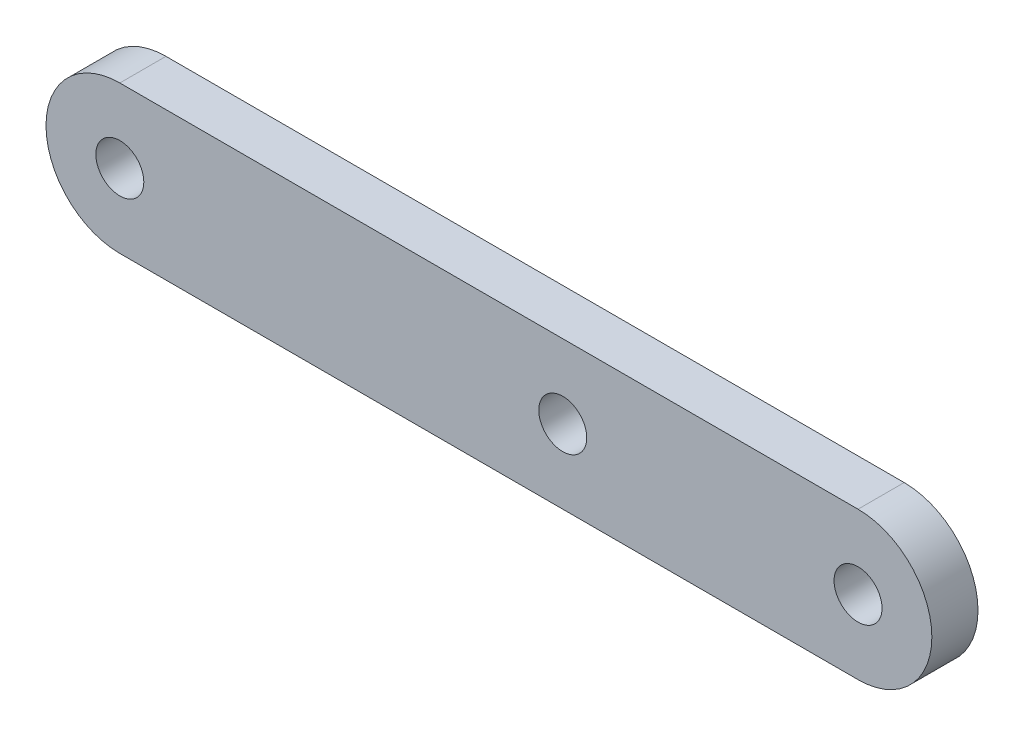
ISO-10303-21;
HEADER;
FILE_DESCRIPTION(('STEP AP214'),'2;1');
FILE_NAME('part.step','',(''),(''),'','','');
FILE_SCHEMA(('AUTOMOTIVE_DESIGN { 1 0 10303 214 1 1 1 1 }'));
ENDSEC;
DATA;
#1=APPLICATION_CONTEXT('core data for automotive mechanical design processes');
#2=APPLICATION_PROTOCOL_DEFINITION('international standard','automotive_design',2000,#1);
#3=PRODUCT_CONTEXT('',#1,'mechanical');
#4=PRODUCT('Part','Part','',(#3));
#5=PRODUCT_RELATED_PRODUCT_CATEGORY('part','',(#4));
#6=PRODUCT_DEFINITION_FORMATION('','',#4);
#7=PRODUCT_DEFINITION_CONTEXT('part definition',#1,'design');
#8=PRODUCT_DEFINITION('design','',#6,#7);
#9=PRODUCT_DEFINITION_SHAPE('','',#8);
#10=(LENGTH_UNIT() NAMED_UNIT(*) SI_UNIT(.MILLI.,.METRE.));
#11=(NAMED_UNIT(*) PLANE_ANGLE_UNIT() SI_UNIT($,.RADIAN.));
#12=(NAMED_UNIT(*) SI_UNIT($,.STERADIAN.) SOLID_ANGLE_UNIT());
#13=UNCERTAINTY_MEASURE_WITH_UNIT(LENGTH_MEASURE(1.E-05),#10,'distance_accuracy_value','');
#14=(GEOMETRIC_REPRESENTATION_CONTEXT(3) GLOBAL_UNCERTAINTY_ASSIGNED_CONTEXT((#13)) GLOBAL_UNIT_ASSIGNED_CONTEXT((#10,
#11,#12)) REPRESENTATION_CONTEXT('',''));
#15=CARTESIAN_POINT('',(0.,0.,0.));
#16=DIRECTION('',(0.,0.,1.));
#17=DIRECTION('',(1.,0.,0.));
#18=AXIS2_PLACEMENT_3D('',#15,#16,#17);
#19=CARTESIAN_POINT('',(0.,0.,1.25));
#20=DIRECTION('',(0.,0.,-1.));
#21=DIRECTION('',(-1.,0.,0.));
#22=AXIS2_PLACEMENT_3D('',#19,#20,#21);
#23=PLANE('',#22);
#24=DIRECTION('',(1.,0.,0.));
#25=VECTOR('',#24,1.);
#26=CARTESIAN_POINT('',(24.,-4.,1.25));
#27=LINE('',#26,#25);
#28=CARTESIAN_POINT('',(20.,-4.,1.25));
#29=VERTEX_POINT('',#28);
#30=CARTESIAN_POINT('',(-20.,-4.00000000000001,1.25));
#31=VERTEX_POINT('',#30);
#32=EDGE_CURVE('E69',#29,#31,#27,.F.);
#33=ORIENTED_EDGE('',*,*,#32,.F.);
#34=CARTESIAN_POINT('',(20.,0.,1.25));
#35=DIRECTION('',(0.,0.,1.));
#36=DIRECTION('',(1.,0.,0.));
#37=AXIS2_PLACEMENT_3D('',#34,#35,#36);
#38=CIRCLE('',#37,4.);
#39=CARTESIAN_POINT('',(20.,4.,1.25));
#40=VERTEX_POINT('',#39);
#41=EDGE_CURVE('E60',#40,#29,#38,.F.);
#42=ORIENTED_EDGE('',*,*,#41,.F.);
#43=DIRECTION('',(-1.,0.,0.));
#44=VECTOR('',#43,1.);
#45=CARTESIAN_POINT('',(-24.,4.,1.25));
#46=LINE('',#45,#44);
#47=CARTESIAN_POINT('',(-20.,4.,1.25));
#48=VERTEX_POINT('',#47);
#49=EDGE_CURVE('E57',#48,#40,#46,.F.);
#50=ORIENTED_EDGE('',*,*,#49,.F.);
#51=CARTESIAN_POINT('',(-20.,0.,1.25));
#52=DIRECTION('',(0.,0.,1.));
#53=DIRECTION('',(1.,0.,0.));
#54=AXIS2_PLACEMENT_3D('',#51,#52,#53);
#55=CIRCLE('',#54,4.);
#56=EDGE_CURVE('E55',#31,#48,#55,.F.);
#57=ORIENTED_EDGE('',*,*,#56,.F.);
#58=EDGE_LOOP('',(#33,#42,#50,#57));
#59=FACE_BOUND('',#58,.T.);
#60=CARTESIAN_POINT('',(-20.,0.,1.25));
#61=DIRECTION('',(0.,0.,1.));
#62=DIRECTION('',(1.,0.,0.));
#63=AXIS2_PLACEMENT_3D('',#60,#61,#62);
#64=CIRCLE('',#63,1.3);
#65=CARTESIAN_POINT('',(-18.7,0.,1.25));
#66=VERTEX_POINT('',#65);
#67=EDGE_CURVE('E81',#66,#66,#64,.F.);
#68=ORIENTED_EDGE('',*,*,#67,.T.);
#69=EDGE_LOOP('',(#68));
#70=FACE_BOUND('',#69,.T.);
#71=CARTESIAN_POINT('',(20.,0.,1.25));
#72=DIRECTION('',(0.,0.,1.));
#73=DIRECTION('',(1.,0.,0.));
#74=AXIS2_PLACEMENT_3D('',#71,#72,#73);
#75=CIRCLE('',#74,1.3);
#76=CARTESIAN_POINT('',(21.3,0.,1.25));
#77=VERTEX_POINT('',#76);
#78=EDGE_CURVE('E96',#77,#77,#75,.F.);
#79=ORIENTED_EDGE('',*,*,#78,.T.);
#80=EDGE_LOOP('',(#79));
#81=FACE_BOUND('',#80,.T.);
#82=CARTESIAN_POINT('',(4.,0.,1.25));
#83=DIRECTION('',(0.,0.,1.));
#84=DIRECTION('',(1.,0.,0.));
#85=AXIS2_PLACEMENT_3D('',#82,#83,#84);
#86=CIRCLE('',#85,1.3);
#87=CARTESIAN_POINT('',(5.3,0.,1.25));
#88=VERTEX_POINT('',#87);
#89=EDGE_CURVE('E19',#88,#88,#86,.F.);
#90=ORIENTED_EDGE('',*,*,#89,.T.);
#91=EDGE_LOOP('',(#90));
#92=FACE_BOUND('',#91,.T.);
#93=ADVANCED_FACE('F16',(#59,#70,#81,#92),#23,.F.);
#94=CARTESIAN_POINT('',(4.,0.,31.9674765557832));
#95=DIRECTION('',(0.,0.,1.));
#96=DIRECTION('',(1.,0.,0.));
#97=AXIS2_PLACEMENT_3D('',#94,#95,#96);
#98=CYLINDRICAL_SURFACE('',#97,1.3);
#99=ORIENTED_EDGE('',*,*,#89,.F.);
#100=EDGE_LOOP('',(#99));
#101=FACE_BOUND('',#100,.T.);
#102=CARTESIAN_POINT('',(4.,0.,-1.25));
#103=DIRECTION('',(0.,0.,1.));
#104=DIRECTION('',(1.,0.,0.));
#105=AXIS2_PLACEMENT_3D('',#102,#103,#104);
#106=CIRCLE('',#105,1.3);
#107=CARTESIAN_POINT('',(5.3,0.,-1.25));
#108=VERTEX_POINT('',#107);
#109=EDGE_CURVE('E92',#108,#108,#106,.T.);
#110=ORIENTED_EDGE('',*,*,#109,.F.);
#111=EDGE_LOOP('',(#110));
#112=FACE_BOUND('',#111,.T.);
#113=ADVANCED_FACE('F104',(#101,#112),#98,.F.);
#114=CARTESIAN_POINT('',(20.,0.,1.25));
#115=DIRECTION('',(0.,0.,1.));
#116=DIRECTION('',(1.,0.,0.));
#117=AXIS2_PLACEMENT_3D('',#114,#115,#116);
#118=CYLINDRICAL_SURFACE('',#117,1.3);
#119=CARTESIAN_POINT('',(20.,0.,-1.25));
#120=DIRECTION('',(0.,0.,1.));
#121=DIRECTION('',(1.,0.,0.));
#122=AXIS2_PLACEMENT_3D('',#119,#120,#121);
#123=CIRCLE('',#122,1.3);
#124=CARTESIAN_POINT('',(21.3,0.,-1.25));
#125=VERTEX_POINT('',#124);
#126=EDGE_CURVE('E89',#125,#125,#123,.T.);
#127=ORIENTED_EDGE('',*,*,#126,.F.);
#128=EDGE_LOOP('',(#127));
#129=FACE_BOUND('',#128,.T.);
#130=ORIENTED_EDGE('',*,*,#78,.F.);
#131=EDGE_LOOP('',(#130));
#132=FACE_BOUND('',#131,.T.);
#133=ADVANCED_FACE('F107',(#129,#132),#118,.F.);
#134=CARTESIAN_POINT('',(-20.,0.,1.25));
#135=DIRECTION('',(0.,0.,1.));
#136=DIRECTION('',(1.,0.,0.));
#137=AXIS2_PLACEMENT_3D('',#134,#135,#136);
#138=CYLINDRICAL_SURFACE('',#137,1.3);
#139=CARTESIAN_POINT('',(-20.,0.,-1.25));
#140=DIRECTION('',(0.,0.,1.));
#141=DIRECTION('',(1.,0.,0.));
#142=AXIS2_PLACEMENT_3D('',#139,#140,#141);
#143=CIRCLE('',#142,1.3);
#144=CARTESIAN_POINT('',(-18.7,0.,-1.25));
#145=VERTEX_POINT('',#144);
#146=EDGE_CURVE('E86',#145,#145,#143,.T.);
#147=ORIENTED_EDGE('',*,*,#146,.F.);
#148=EDGE_LOOP('',(#147));
#149=FACE_BOUND('',#148,.T.);
#150=ORIENTED_EDGE('',*,*,#67,.F.);
#151=EDGE_LOOP('',(#150));
#152=FACE_BOUND('',#151,.T.);
#153=ADVANCED_FACE('F130',(#149,#152),#138,.F.);
#154=CARTESIAN_POINT('',(24.,-4.,1.25));
#155=DIRECTION('',(0.,-1.,0.));
#156=DIRECTION('',(1.,0.,0.));
#157=AXIS2_PLACEMENT_3D('',#154,#155,#156);
#158=PLANE('',#157);
#159=DIRECTION('',(-1.,0.,0.));
#160=VECTOR('',#159,1.);
#161=CARTESIAN_POINT('',(0.,-4.,-1.25));
#162=LINE('',#161,#160);
#163=CARTESIAN_POINT('',(20.,-4.,-1.25));
#164=VERTEX_POINT('',#163);
#165=CARTESIAN_POINT('',(-20.,-4.,-1.25));
#166=VERTEX_POINT('',#165);
#167=EDGE_CURVE('E85',#164,#166,#162,.T.);
#168=ORIENTED_EDGE('',*,*,#167,.F.);
#169=DIRECTION('',(0.,0.,1.));
#170=VECTOR('',#169,1.);
#171=CARTESIAN_POINT('',(20.,-4.,1.25));
#172=LINE('',#171,#170);
#173=EDGE_CURVE('E75',#29,#164,#172,.F.);
#174=ORIENTED_EDGE('',*,*,#173,.F.);
#175=ORIENTED_EDGE('',*,*,#32,.T.);
#176=DIRECTION('',(0.,0.,1.));
#177=VECTOR('',#176,1.);
#178=CARTESIAN_POINT('',(-20.,-4.,1.25));
#179=LINE('',#178,#177);
#180=EDGE_CURVE('E63',#166,#31,#179,.T.);
#181=ORIENTED_EDGE('',*,*,#180,.F.);
#182=EDGE_LOOP('',(#168,#174,#175,#181));
#183=FACE_BOUND('',#182,.T.);
#184=ADVANCED_FACE('F127',(#183),#158,.T.);
#185=CARTESIAN_POINT('',(-20.,0.,1.25));
#186=DIRECTION('',(0.,0.,1.));
#187=DIRECTION('',(1.,0.,0.));
#188=AXIS2_PLACEMENT_3D('',#185,#186,#187);
#189=CYLINDRICAL_SURFACE('',#188,4.);
#190=CARTESIAN_POINT('',(-20.,0.,-1.25));
#191=DIRECTION('',(0.,0.,1.));
#192=DIRECTION('',(1.,0.,0.));
#193=AXIS2_PLACEMENT_3D('',#190,#191,#192);
#194=CIRCLE('',#193,4.);
#195=CARTESIAN_POINT('',(-20.,4.,-1.25));
#196=VERTEX_POINT('',#195);
#197=EDGE_CURVE('E83',#166,#196,#194,.F.);
#198=ORIENTED_EDGE('',*,*,#197,.F.);
#199=ORIENTED_EDGE('',*,*,#180,.T.);
#200=ORIENTED_EDGE('',*,*,#56,.T.);
#201=DIRECTION('',(0.,0.,1.));
#202=VECTOR('',#201,1.);
#203=CARTESIAN_POINT('',(-20.,4.,1.25));
#204=LINE('',#203,#202);
#205=EDGE_CURVE('E62',#196,#48,#204,.T.);
#206=ORIENTED_EDGE('',*,*,#205,.F.);
#207=EDGE_LOOP('',(#198,#199,#200,#206));
#208=FACE_BOUND('',#207,.T.);
#209=ADVANCED_FACE('F68',(#208),#189,.T.);
#210=CARTESIAN_POINT('',(-24.,4.,1.25));
#211=DIRECTION('',(0.,1.,0.));
#212=DIRECTION('',(-1.,0.,0.));
#213=AXIS2_PLACEMENT_3D('',#210,#211,#212);
#214=PLANE('',#213);
#215=DIRECTION('',(-1.,0.,0.));
#216=VECTOR('',#215,1.);
#217=CARTESIAN_POINT('',(0.,4.,-1.25));
#218=LINE('',#217,#216);
#219=CARTESIAN_POINT('',(20.,4.,-1.25));
#220=VERTEX_POINT('',#219);
#221=EDGE_CURVE('E25',#196,#220,#218,.F.);
#222=ORIENTED_EDGE('',*,*,#221,.F.);
#223=ORIENTED_EDGE('',*,*,#205,.T.);
#224=ORIENTED_EDGE('',*,*,#49,.T.);
#225=DIRECTION('',(0.,0.,1.));
#226=VECTOR('',#225,1.);
#227=CARTESIAN_POINT('',(20.,4.,1.25));
#228=LINE('',#227,#226);
#229=EDGE_CURVE('E34',#220,#40,#228,.T.);
#230=ORIENTED_EDGE('',*,*,#229,.F.);
#231=EDGE_LOOP('',(#222,#223,#224,#230));
#232=FACE_BOUND('',#231,.T.);
#233=ADVANCED_FACE('F71',(#232),#214,.T.);
#234=CARTESIAN_POINT('',(20.,0.,1.25));
#235=DIRECTION('',(0.,0.,1.));
#236=DIRECTION('',(1.,0.,0.));
#237=AXIS2_PLACEMENT_3D('',#234,#235,#236);
#238=CYLINDRICAL_SURFACE('',#237,4.);
#239=CARTESIAN_POINT('',(20.,0.,-1.25));
#240=DIRECTION('',(0.,0.,1.));
#241=DIRECTION('',(1.,0.,0.));
#242=AXIS2_PLACEMENT_3D('',#239,#240,#241);
#243=CIRCLE('',#242,4.);
#244=EDGE_CURVE('E11',#220,#164,#243,.F.);
#245=ORIENTED_EDGE('',*,*,#244,.F.);
#246=ORIENTED_EDGE('',*,*,#229,.T.);
#247=ORIENTED_EDGE('',*,*,#41,.T.);
#248=ORIENTED_EDGE('',*,*,#173,.T.);
#249=EDGE_LOOP('',(#245,#246,#247,#248));
#250=FACE_BOUND('',#249,.T.);
#251=ADVANCED_FACE('F112',(#250),#238,.T.);
#252=CARTESIAN_POINT('',(0.,0.,-1.25));
#253=DIRECTION('',(0.,0.,-1.));
#254=DIRECTION('',(-1.,0.,0.));
#255=AXIS2_PLACEMENT_3D('',#252,#253,#254);
#256=PLANE('',#255);
#257=ORIENTED_EDGE('',*,*,#221,.T.);
#258=ORIENTED_EDGE('',*,*,#244,.T.);
#259=ORIENTED_EDGE('',*,*,#167,.T.);
#260=ORIENTED_EDGE('',*,*,#197,.T.);
#261=EDGE_LOOP('',(#257,#258,#259,#260));
#262=FACE_BOUND('',#261,.T.);
#263=ORIENTED_EDGE('',*,*,#146,.T.);
#264=EDGE_LOOP('',(#263));
#265=FACE_BOUND('',#264,.T.);
#266=ORIENTED_EDGE('',*,*,#126,.T.);
#267=EDGE_LOOP('',(#266));
#268=FACE_BOUND('',#267,.T.);
#269=ORIENTED_EDGE('',*,*,#109,.T.);
#270=EDGE_LOOP('',(#269));
#271=FACE_BOUND('',#270,.T.);
#272=ADVANCED_FACE('F110',(#262,#265,#268,#271),#256,.T.);
#273=CLOSED_SHELL('',(#93,#113,#133,#153,#184,#209,#233,#251,#272));
#274=MANIFOLD_SOLID_BREP('B1',#273);
#275=ADVANCED_BREP_SHAPE_REPRESENTATION('',(#18,#274),#14);
#276=SHAPE_DEFINITION_REPRESENTATION(#9,#275);
ENDSEC;
END-ISO-10303-21;
